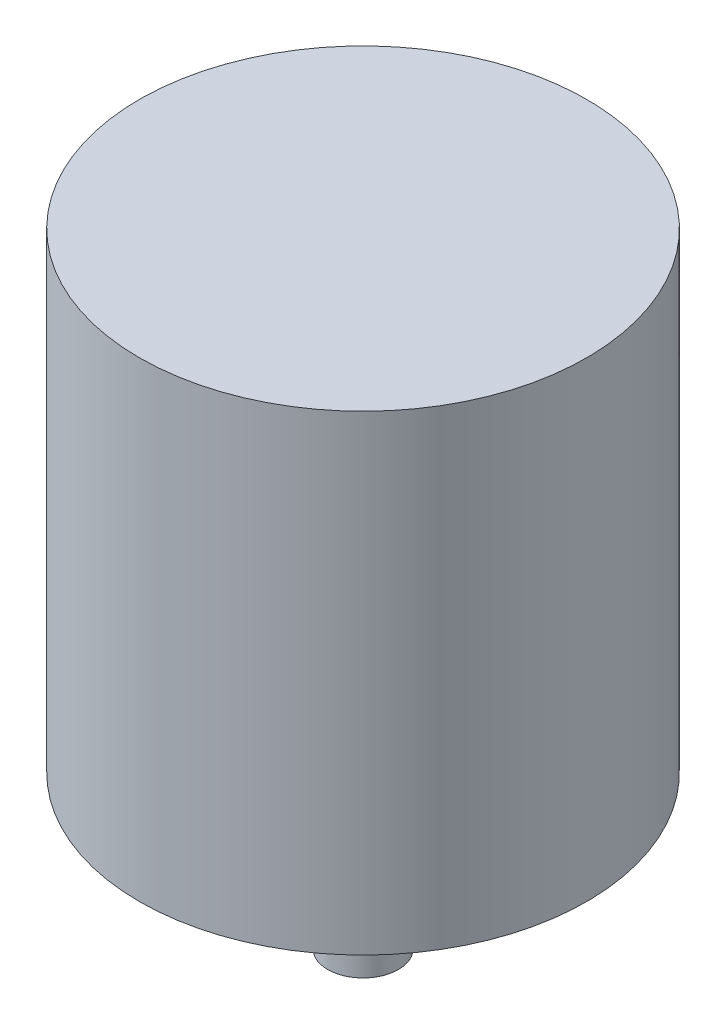
ISO-10303-21;
HEADER;
FILE_DESCRIPTION(('STEP AP214'),'2;1');
FILE_NAME('part.step','',(''),(''),'','','');
FILE_SCHEMA(('AUTOMOTIVE_DESIGN { 1 0 10303 214 1 1 1 1 }'));
ENDSEC;
DATA;
#1=APPLICATION_CONTEXT('core data for automotive mechanical design processes');
#2=APPLICATION_PROTOCOL_DEFINITION('international standard','automotive_design',2000,#1);
#3=PRODUCT_CONTEXT('',#1,'mechanical');
#4=PRODUCT('Part','Part','',(#3));
#5=PRODUCT_RELATED_PRODUCT_CATEGORY('part','',(#4));
#6=PRODUCT_DEFINITION_FORMATION('','',#4);
#7=PRODUCT_DEFINITION_CONTEXT('part definition',#1,'design');
#8=PRODUCT_DEFINITION('design','',#6,#7);
#9=PRODUCT_DEFINITION_SHAPE('','',#8);
#10=(LENGTH_UNIT() NAMED_UNIT(*) SI_UNIT(.MILLI.,.METRE.));
#11=(NAMED_UNIT(*) PLANE_ANGLE_UNIT() SI_UNIT($,.RADIAN.));
#12=(NAMED_UNIT(*) SI_UNIT($,.STERADIAN.) SOLID_ANGLE_UNIT());
#13=UNCERTAINTY_MEASURE_WITH_UNIT(LENGTH_MEASURE(1.E-05),#10,'distance_accuracy_value','');
#14=(GEOMETRIC_REPRESENTATION_CONTEXT(3) GLOBAL_UNCERTAINTY_ASSIGNED_CONTEXT((#13)) GLOBAL_UNIT_ASSIGNED_CONTEXT((#10,
#11,#12)) REPRESENTATION_CONTEXT('',''));
#15=CARTESIAN_POINT('',(0.,0.,0.));
#16=DIRECTION('',(0.,0.,1.));
#17=DIRECTION('',(1.,0.,0.));
#18=AXIS2_PLACEMENT_3D('',#15,#16,#17);
#19=CARTESIAN_POINT('',(0.,40.,0.));
#20=DIRECTION('',(0.,-1.,0.));
#21=DIRECTION('',(0.,0.,-1.));
#22=AXIS2_PLACEMENT_3D('',#19,#20,#21);
#23=CYLINDRICAL_SURFACE('',#22,19.);
#24=CARTESIAN_POINT('',(0.,40.,0.));
#25=DIRECTION('',(0.,1.,0.));
#26=DIRECTION('',(0.,0.,1.));
#27=AXIS2_PLACEMENT_3D('',#24,#25,#26);
#28=CIRCLE('',#27,19.);
#29=CARTESIAN_POINT('',(0.,40.,19.));
#30=VERTEX_POINT('',#29);
#31=EDGE_CURVE('E45',#30,#30,#28,.T.);
#32=ORIENTED_EDGE('',*,*,#31,.F.);
#33=EDGE_LOOP('',(#32));
#34=FACE_BOUND('',#33,.T.);
#35=CARTESIAN_POINT('',(0.,0.,0.));
#36=DIRECTION('',(0.,1.,0.));
#37=DIRECTION('',(0.,0.,1.));
#38=AXIS2_PLACEMENT_3D('',#35,#36,#37);
#39=CIRCLE('',#38,19.);
#40=CARTESIAN_POINT('',(0.,0.,19.));
#41=VERTEX_POINT('',#40);
#42=EDGE_CURVE('E40',#41,#41,#39,.T.);
#43=ORIENTED_EDGE('',*,*,#42,.T.);
#44=EDGE_LOOP('',(#43));
#45=FACE_BOUND('',#44,.T.);
#46=ADVANCED_FACE('F37',(#34,#45),#23,.T.);
#47=CARTESIAN_POINT('',(0.,40.,0.));
#48=DIRECTION('',(0.,1.,0.));
#49=DIRECTION('',(0.,0.,1.));
#50=AXIS2_PLACEMENT_3D('',#47,#48,#49);
#51=PLANE('',#50);
#52=ORIENTED_EDGE('',*,*,#31,.T.);
#53=EDGE_LOOP('',(#52));
#54=FACE_BOUND('',#53,.T.);
#55=ADVANCED_FACE('F65',(#54),#51,.T.);
#56=CARTESIAN_POINT('',(0.,0.,0.));
#57=DIRECTION('',(0.,1.,0.));
#58=DIRECTION('',(0.,0.,1.));
#59=AXIS2_PLACEMENT_3D('',#56,#57,#58);
#60=PLANE('',#59);
#61=CARTESIAN_POINT('',(0.,0.,0.));
#62=DIRECTION('',(0.,-1.,0.));
#63=DIRECTION('',(0.,0.,-1.));
#64=AXIS2_PLACEMENT_3D('',#61,#62,#63);
#65=CIRCLE('',#64,3.);
#66=CARTESIAN_POINT('',(0.,0.,3.));
#67=VERTEX_POINT('',#66);
#68=EDGE_CURVE('E10',#67,#67,#65,.T.);
#69=ORIENTED_EDGE('',*,*,#68,.F.);
#70=EDGE_LOOP('',(#69));
#71=FACE_BOUND('',#70,.T.);
#72=ORIENTED_EDGE('',*,*,#42,.F.);
#73=EDGE_LOOP('',(#72));
#74=FACE_BOUND('',#73,.T.);
#75=ADVANCED_FACE('F62',(#71,#74),#60,.F.);
#76=CARTESIAN_POINT('',(0.,-13.,0.));
#77=DIRECTION('',(0.,1.,0.));
#78=DIRECTION('',(0.,0.,1.));
#79=AXIS2_PLACEMENT_3D('',#76,#77,#78);
#80=CYLINDRICAL_SURFACE('',#79,3.);
#81=CARTESIAN_POINT('',(0.,-13.,0.));
#82=DIRECTION('',(0.,-1.,0.));
#83=DIRECTION('',(0.,0.,-1.));
#84=AXIS2_PLACEMENT_3D('',#81,#82,#83);
#85=CIRCLE('',#84,3.);
#86=CARTESIAN_POINT('',(0.,-13.,3.));
#87=VERTEX_POINT('',#86);
#88=EDGE_CURVE('E52',#87,#87,#85,.T.);
#89=CARTESIAN_POINT('',(0.,-13.,3.));
#90=CARTESIAN_POINT('',(0.,-12.8645833333333,3.));
#91=CARTESIAN_POINT('',(0.,-12.7291666666667,3.));
#92=CARTESIAN_POINT('',(0.,-12.4583333333333,3.));
#93=CARTESIAN_POINT('',(0.,-12.3229166666667,3.));
#94=CARTESIAN_POINT('',(0.,-12.0520833333333,3.));
#95=CARTESIAN_POINT('',(0.,-11.9166666666667,3.));
#96=CARTESIAN_POINT('',(0.,-11.6458333333333,3.));
#97=CARTESIAN_POINT('',(0.,-11.5104166666667,3.));
#98=CARTESIAN_POINT('',(0.,-11.2395833333333,3.));
#99=CARTESIAN_POINT('',(0.,-11.1041666666667,3.));
#100=CARTESIAN_POINT('',(0.,-10.8333333333333,3.));
#101=CARTESIAN_POINT('',(0.,-10.6979166666667,3.));
#102=CARTESIAN_POINT('',(0.,-10.4270833333333,3.));
#103=CARTESIAN_POINT('',(0.,-10.2916666666667,3.));
#104=CARTESIAN_POINT('',(0.,-10.0208333333333,3.));
#105=CARTESIAN_POINT('',(0.,-9.88541666666667,3.));
#106=CARTESIAN_POINT('',(0.,-9.61458333333333,3.));
#107=CARTESIAN_POINT('',(0.,-9.47916666666667,3.));
#108=CARTESIAN_POINT('',(0.,-9.20833333333333,3.));
#109=CARTESIAN_POINT('',(0.,-9.07291666666667,3.));
#110=CARTESIAN_POINT('',(0.,-8.80208333333333,3.));
#111=CARTESIAN_POINT('',(0.,-8.66666666666667,3.));
#112=CARTESIAN_POINT('',(0.,-8.39583333333333,3.));
#113=CARTESIAN_POINT('',(0.,-8.26041666666667,3.));
#114=CARTESIAN_POINT('',(0.,-7.98958333333333,3.));
#115=CARTESIAN_POINT('',(0.,-7.85416666666667,3.));
#116=CARTESIAN_POINT('',(0.,-7.58333333333333,3.));
#117=CARTESIAN_POINT('',(0.,-7.44791666666667,3.));
#118=CARTESIAN_POINT('',(0.,-7.17708333333333,3.));
#119=CARTESIAN_POINT('',(0.,-7.04166666666667,3.));
#120=CARTESIAN_POINT('',(0.,-6.77083333333333,3.));
#121=CARTESIAN_POINT('',(0.,-6.63541666666667,3.));
#122=CARTESIAN_POINT('',(0.,-6.36458333333333,3.));
#123=CARTESIAN_POINT('',(0.,-6.22916666666667,3.));
#124=CARTESIAN_POINT('',(0.,-5.95833333333333,3.));
#125=CARTESIAN_POINT('',(0.,-5.82291666666667,3.));
#126=CARTESIAN_POINT('',(0.,-5.55208333333333,3.));
#127=CARTESIAN_POINT('',(0.,-5.41666666666667,3.));
#128=CARTESIAN_POINT('',(0.,-5.14583333333333,3.));
#129=CARTESIAN_POINT('',(0.,-5.01041666666667,3.));
#130=CARTESIAN_POINT('',(0.,-4.73958333333333,3.));
#131=CARTESIAN_POINT('',(0.,-4.60416666666667,3.));
#132=CARTESIAN_POINT('',(0.,-4.33333333333333,3.));
#133=CARTESIAN_POINT('',(0.,-4.19791666666667,3.));
#134=CARTESIAN_POINT('',(0.,-3.92708333333333,3.));
#135=CARTESIAN_POINT('',(0.,-3.79166666666667,3.));
#136=CARTESIAN_POINT('',(0.,-3.52083333333333,3.));
#137=CARTESIAN_POINT('',(0.,-3.38541666666667,3.));
#138=CARTESIAN_POINT('',(0.,-3.11458333333333,3.));
#139=CARTESIAN_POINT('',(0.,-2.97916666666667,3.));
#140=CARTESIAN_POINT('',(0.,-2.70833333333333,3.));
#141=CARTESIAN_POINT('',(0.,-2.57291666666667,3.));
#142=CARTESIAN_POINT('',(0.,-2.30208333333333,3.));
#143=CARTESIAN_POINT('',(0.,-2.16666666666667,3.));
#144=CARTESIAN_POINT('',(0.,-1.89583333333333,3.));
#145=CARTESIAN_POINT('',(0.,-1.76041666666667,3.));
#146=CARTESIAN_POINT('',(0.,-1.48958333333333,3.));
#147=CARTESIAN_POINT('',(0.,-1.35416666666667,3.));
#148=CARTESIAN_POINT('',(0.,-1.08333333333333,3.));
#149=CARTESIAN_POINT('',(0.,-0.947916666666667,3.));
#150=CARTESIAN_POINT('',(0.,-0.677083333333334,3.));
#151=CARTESIAN_POINT('',(0.,-0.541666666666667,3.));
#152=CARTESIAN_POINT('',(0.,-0.270833333333334,3.));
#153=CARTESIAN_POINT('',(0.,-0.135416666666667,3.));
#154=CARTESIAN_POINT('',(0.,0.,3.));
#155=B_SPLINE_CURVE_WITH_KNOTS('',3,(#89,#90,#91,#92,#93,#94,#95,#96,#97,#98,#99,#100,#101,#102,
#103,#104,#105,#106,#107,#108,#109,#110,#111,#112,#113,#114,#115,#116,#117,#118,#119,#120,#121,
#122,#123,#124,#125,#126,#127,#128,#129,#130,#131,#132,#133,#134,#135,#136,#137,#138,#139,#140,
#141,#142,#143,#144,#145,#146,#147,#148,#149,#150,#151,#152,#153,#154),.UNSPECIFIED.,.F.,.F.,(4,
2,2,2,2,2,2,2,2,2,2,2,2,2,2,2,2,2,2,2,2,2,2,2,2,2,2,2,2,2,2,2,4),(0.,0.406249999999999,
0.812499999999999,1.21875,1.625,2.03125,2.4375,2.84375,3.25,3.65625,4.0625,4.46875,4.875,
5.28125,5.6875,6.09375,6.5,6.90625,7.3125,7.71875,8.125,8.53125,8.9375,9.34375,9.75,10.15625,
10.5625,10.96875,11.375,11.78125,12.1875,12.59375,13.),.UNSPECIFIED.);
#156=EDGE_CURVE('BSEAM64',#87,#67,#155,.T.);
#157=ORIENTED_EDGE('',*,*,#88,.F.);
#158=ORIENTED_EDGE('',*,*,#68,.T.);
#159=ORIENTED_EDGE('',*,*,#156,.T.);
#160=ORIENTED_EDGE('',*,*,#156,.F.);
#161=EDGE_LOOP('',(#157,#159,#158,#160));
#162=FACE_BOUND('',#161,.T.);
#163=ADVANCED_FACE('F64',(#162),#80,.T.);
#164=CARTESIAN_POINT('',(0.,-13.,0.));
#165=DIRECTION('',(0.,-1.,0.));
#166=DIRECTION('',(0.,0.,-1.));
#167=AXIS2_PLACEMENT_3D('',#164,#165,#166);
#168=PLANE('',#167);
#169=ORIENTED_EDGE('',*,*,#88,.T.);
#170=EDGE_LOOP('',(#169));
#171=FACE_BOUND('',#170,.T.);
#172=ADVANCED_FACE('F71',(#171),#168,.T.);
#173=CLOSED_SHELL('',(#46,#55,#75,#163,#172));
#174=MANIFOLD_SOLID_BREP('B2',#173);
#175=ADVANCED_BREP_SHAPE_REPRESENTATION('',(#18,#174),#14);
#176=SHAPE_DEFINITION_REPRESENTATION(#9,#175);
ENDSEC;
END-ISO-10303-21;
